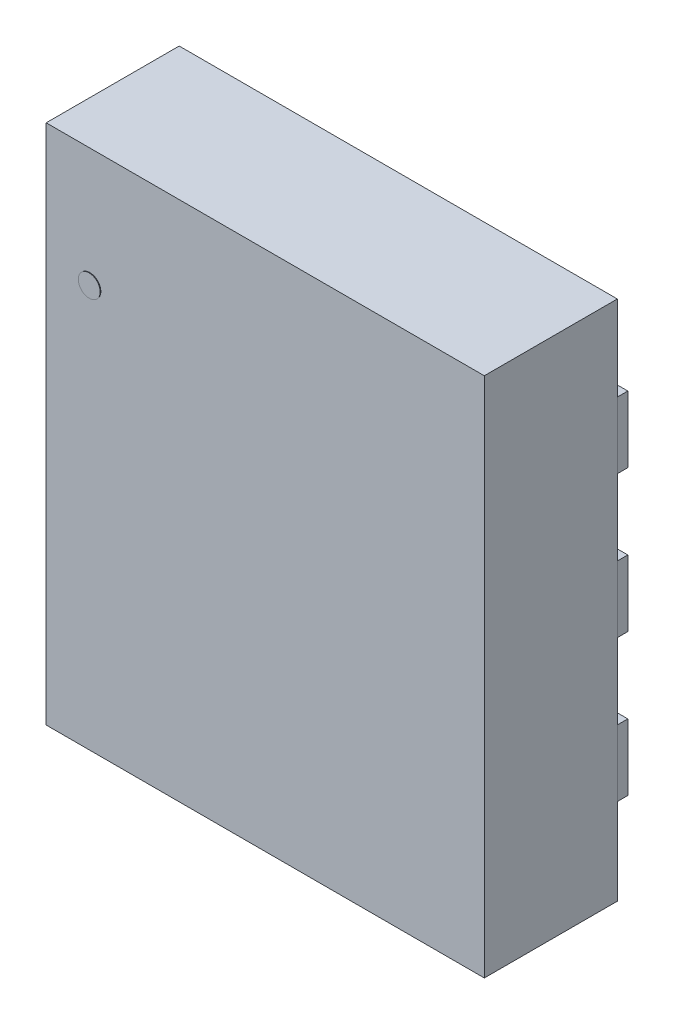
ISO-10303-21;
HEADER;
FILE_DESCRIPTION(('STEP AP214'),'2;1');
FILE_NAME('part.step','',(''),(''),'','','');
FILE_SCHEMA(('AUTOMOTIVE_DESIGN { 1 0 10303 214 1 1 1 1 }'));
ENDSEC;
DATA;
#1=APPLICATION_CONTEXT('core data for automotive mechanical design processes');
#2=APPLICATION_PROTOCOL_DEFINITION('international standard','automotive_design',2000,#1);
#3=PRODUCT_CONTEXT('',#1,'mechanical');
#4=PRODUCT('Part','Part','',(#3));
#5=PRODUCT_RELATED_PRODUCT_CATEGORY('part','',(#4));
#6=PRODUCT_DEFINITION_FORMATION('','',#4);
#7=PRODUCT_DEFINITION_CONTEXT('part definition',#1,'design');
#8=PRODUCT_DEFINITION('design','',#6,#7);
#9=PRODUCT_DEFINITION_SHAPE('','',#8);
#10=(LENGTH_UNIT() NAMED_UNIT(*) SI_UNIT(.MILLI.,.METRE.));
#11=(NAMED_UNIT(*) PLANE_ANGLE_UNIT() SI_UNIT($,.RADIAN.));
#12=(NAMED_UNIT(*) SI_UNIT($,.STERADIAN.) SOLID_ANGLE_UNIT());
#13=UNCERTAINTY_MEASURE_WITH_UNIT(LENGTH_MEASURE(1.E-05),#10,'distance_accuracy_value','');
#14=(GEOMETRIC_REPRESENTATION_CONTEXT(3) GLOBAL_UNCERTAINTY_ASSIGNED_CONTEXT((#13)) GLOBAL_UNIT_ASSIGNED_CONTEXT((#10,
#11,#12)) REPRESENTATION_CONTEXT('',''));
#15=CARTESIAN_POINT('',(0.,0.,0.));
#16=DIRECTION('',(0.,0.,1.));
#17=DIRECTION('',(1.,0.,0.));
#18=AXIS2_PLACEMENT_3D('',#15,#16,#17);
#19=CARTESIAN_POINT('',(-0.803,0.65,0.663));
#20=DIRECTION('',(0.,0.,1.));
#21=DIRECTION('',(1.,0.,0.));
#22=AXIS2_PLACEMENT_3D('',#19,#20,#21);
#23=PLANE('',#22);
#24=CARTESIAN_POINT('',(-0.803,0.65,0.663));
#25=DIRECTION('',(0.,0.,1.));
#26=DIRECTION('',(1.,0.,0.));
#27=AXIS2_PLACEMENT_3D('',#24,#25,#26);
#28=CIRCLE('',#27,0.050165);
#29=CARTESIAN_POINT('',(-0.853,0.65,0.663));
#30=VERTEX_POINT('',#29);
#31=EDGE_CURVE('P0_E44',#30,#30,#28,.T.);
#32=ORIENTED_EDGE('',*,*,#31,.T.);
#33=EDGE_LOOP('',(#32));
#34=FACE_BOUND('',#33,.T.);
#35=ADVANCED_FACE('P0_F16',(#34),#23,.T.);
#36=CARTESIAN_POINT('',(-0.803,0.65,0.66));
#37=DIRECTION('',(0.,0.,1.));
#38=DIRECTION('',(1.,0.,0.));
#39=AXIS2_PLACEMENT_3D('',#36,#37,#38);
#40=PLANE('',#39);
#41=CARTESIAN_POINT('',(-0.803,0.65,0.66));
#42=DIRECTION('',(0.,0.,-1.));
#43=DIRECTION('',(1.,0.,0.));
#44=AXIS2_PLACEMENT_3D('',#41,#42,#43);
#45=CIRCLE('',#44,0.050165);
#46=CARTESIAN_POINT('',(-0.853,0.65,0.66));
#47=VERTEX_POINT('',#46);
#48=EDGE_CURVE('P0_E11',#47,#47,#45,.T.);
#49=ORIENTED_EDGE('',*,*,#48,.T.);
#50=EDGE_LOOP('',(#49));
#51=FACE_BOUND('',#50,.T.);
#52=ADVANCED_FACE('P0_F18',(#51),#40,.F.);
#53=CARTESIAN_POINT('',(-0.803,0.65,0.66));
#54=DIRECTION('',(0.,0.,1.));
#55=DIRECTION('',(1.,0.,0.));
#56=AXIS2_PLACEMENT_3D('',#53,#54,#55);
#57=CYLINDRICAL_SURFACE('',#56,0.050165);
#58=ORIENTED_EDGE('',*,*,#31,.F.);
#59=CARTESIAN_POINT('',(-0.853165,0.65,0.66));
#60=CARTESIAN_POINT('',(-0.853165,0.65,0.663));
#61=(BOUNDED_CURVE() B_SPLINE_CURVE(1,(#59,#60),.UNSPECIFIED.,.F.,
.F.) B_SPLINE_CURVE_WITH_KNOTS((2,2),(0.,0.003),
.UNSPECIFIED.) CURVE() GEOMETRIC_REPRESENTATION_ITEM() RATIONAL_B_SPLINE_CURVE((1.,1.)) REPRESENTATION_ITEM(''));
#62=EDGE_CURVE('P0_E27',#47,#30,#61,.T.);
#63=ORIENTED_EDGE('',*,*,#62,.F.);
#64=ORIENTED_EDGE('',*,*,#48,.F.);
#65=ORIENTED_EDGE('',*,*,#62,.T.);
#66=EDGE_LOOP('',(#58,#63,#64,#65));
#67=FACE_BOUND('',#66,.T.);
#68=ADVANCED_FACE('P0_F43',(#67),#57,.T.);
#69=CLOSED_SHELL('',(#35,#52,#68));
#70=MANIFOLD_SOLID_BREP('P0_B1',#69);
#71=CARTESIAN_POINT('',(-1.003,-1.194,0.66));
#72=DIRECTION('',(0.,0.,1.));
#73=DIRECTION('',(1.,0.,0.));
#74=AXIS2_PLACEMENT_3D('',#71,#72,#73);
#75=PLANE('',#74);
#76=DIRECTION('',(1.,0.,0.));
#77=VECTOR('',#76,1.);
#78=CARTESIAN_POINT('',(-1.003,-1.194,0.66));
#79=LINE('',#78,#77);
#80=CARTESIAN_POINT('',(-1.003,-1.194,0.66));
#81=VERTEX_POINT('',#80);
#82=CARTESIAN_POINT('',(1.003,-1.194,0.66));
#83=VERTEX_POINT('',#82);
#84=EDGE_CURVE('P1_E89',#81,#83,#79,.T.);
#85=ORIENTED_EDGE('',*,*,#84,.T.);
#86=DIRECTION('',(0.,1.,0.));
#87=VECTOR('',#86,1.);
#88=CARTESIAN_POINT('',(1.003,-1.194,0.66));
#89=LINE('',#88,#87);
#90=CARTESIAN_POINT('',(1.003,1.194,0.66));
#91=VERTEX_POINT('',#90);
#92=EDGE_CURVE('P1_E57',#83,#91,#89,.T.);
#93=ORIENTED_EDGE('',*,*,#92,.T.);
#94=DIRECTION('',(-1.,0.,0.));
#95=VECTOR('',#94,1.);
#96=CARTESIAN_POINT('',(1.003,1.194,0.66));
#97=LINE('',#96,#95);
#98=CARTESIAN_POINT('',(-1.003,1.194,0.66));
#99=VERTEX_POINT('',#98);
#100=EDGE_CURVE('P1_E103',#91,#99,#97,.T.);
#101=ORIENTED_EDGE('',*,*,#100,.T.);
#102=DIRECTION('',(0.,-1.,0.));
#103=VECTOR('',#102,1.);
#104=CARTESIAN_POINT('',(-1.003,1.194,0.66));
#105=LINE('',#104,#103);
#106=EDGE_CURVE('P1_E11',#99,#81,#105,.T.);
#107=ORIENTED_EDGE('',*,*,#106,.T.);
#108=EDGE_LOOP('',(#85,#93,#101,#107));
#109=FACE_BOUND('',#108,.T.);
#110=ADVANCED_FACE('P1_F16',(#109),#75,.T.);
#111=CARTESIAN_POINT('',(-1.003,1.194,0.051));
#112=DIRECTION('',(0.,0.,-1.));
#113=DIRECTION('',(0.,-1.,0.));
#114=AXIS2_PLACEMENT_3D('',#111,#112,#113);
#115=PLANE('',#114);
#116=DIRECTION('',(1.,0.,0.));
#117=VECTOR('',#116,1.);
#118=CARTESIAN_POINT('',(-1.003,1.194,0.051));
#119=LINE('',#118,#117);
#120=CARTESIAN_POINT('',(-1.003,1.194,0.051));
#121=VERTEX_POINT('',#120);
#122=CARTESIAN_POINT('',(1.003,1.194,0.051));
#123=VERTEX_POINT('',#122);
#124=EDGE_CURVE('P1_E79',#121,#123,#119,.T.);
#125=ORIENTED_EDGE('',*,*,#124,.T.);
#126=DIRECTION('',(0.,-1.,0.));
#127=VECTOR('',#126,1.);
#128=CARTESIAN_POINT('',(1.003,1.194,0.051));
#129=LINE('',#128,#127);
#130=CARTESIAN_POINT('',(1.003,-1.194,0.051));
#131=VERTEX_POINT('',#130);
#132=EDGE_CURVE('P1_E74',#123,#131,#129,.T.);
#133=ORIENTED_EDGE('',*,*,#132,.T.);
#134=DIRECTION('',(-1.,0.,0.));
#135=VECTOR('',#134,1.);
#136=CARTESIAN_POINT('',(1.003,-1.194,0.051));
#137=LINE('',#136,#135);
#138=CARTESIAN_POINT('',(-1.003,-1.194,0.051));
#139=VERTEX_POINT('',#138);
#140=EDGE_CURVE('P1_E77',#131,#139,#137,.T.);
#141=ORIENTED_EDGE('',*,*,#140,.T.);
#142=DIRECTION('',(0.,1.,0.));
#143=VECTOR('',#142,1.);
#144=CARTESIAN_POINT('',(-1.003,-1.194,0.051));
#145=LINE('',#144,#143);
#146=EDGE_CURVE('P1_E27',#139,#121,#145,.T.);
#147=ORIENTED_EDGE('',*,*,#146,.T.);
#148=EDGE_LOOP('',(#125,#133,#141,#147));
#149=FACE_BOUND('',#148,.T.);
#150=ADVANCED_FACE('P1_F75',(#149),#115,.T.);
#151=CARTESIAN_POINT('',(-1.003,1.194,0.051));
#152=DIRECTION('',(-1.,0.,0.));
#153=DIRECTION('',(0.,0.,1.));
#154=AXIS2_PLACEMENT_3D('',#151,#152,#153);
#155=PLANE('',#154);
#156=ORIENTED_EDGE('',*,*,#146,.F.);
#157=DIRECTION('',(0.,0.,1.));
#158=VECTOR('',#157,1.);
#159=CARTESIAN_POINT('',(-1.003,-1.194,0.051));
#160=LINE('',#159,#158);
#161=EDGE_CURVE('P1_E82',#139,#81,#160,.T.);
#162=ORIENTED_EDGE('',*,*,#161,.T.);
#163=ORIENTED_EDGE('',*,*,#106,.F.);
#164=DIRECTION('',(0.,0.,-1.));
#165=VECTOR('',#164,1.);
#166=CARTESIAN_POINT('',(-1.003,1.194,0.66));
#167=LINE('',#166,#165);
#168=EDGE_CURVE('P1_E99',#99,#121,#167,.T.);
#169=ORIENTED_EDGE('',*,*,#168,.T.);
#170=EDGE_LOOP('',(#156,#162,#163,#169));
#171=FACE_BOUND('',#170,.T.);
#172=ADVANCED_FACE('P1_F112',(#171),#155,.T.);
#173=CARTESIAN_POINT('',(1.003,1.194,0.051));
#174=DIRECTION('',(0.,1.,0.));
#175=DIRECTION('',(1.,0.,0.));
#176=AXIS2_PLACEMENT_3D('',#173,#174,#175);
#177=PLANE('',#176);
#178=ORIENTED_EDGE('',*,*,#124,.F.);
#179=ORIENTED_EDGE('',*,*,#168,.F.);
#180=ORIENTED_EDGE('',*,*,#100,.F.);
#181=DIRECTION('',(0.,0.,-1.));
#182=VECTOR('',#181,1.);
#183=CARTESIAN_POINT('',(1.003,1.194,0.66));
#184=LINE('',#183,#182);
#185=EDGE_CURVE('P1_E20',#91,#123,#184,.T.);
#186=ORIENTED_EDGE('',*,*,#185,.T.);
#187=EDGE_LOOP('',(#178,#179,#180,#186));
#188=FACE_BOUND('',#187,.T.);
#189=ADVANCED_FACE('P1_F114',(#188),#177,.T.);
#190=CARTESIAN_POINT('',(1.003,-1.194,0.051));
#191=DIRECTION('',(1.,0.,0.));
#192=DIRECTION('',(0.,1.,0.));
#193=AXIS2_PLACEMENT_3D('',#190,#191,#192);
#194=PLANE('',#193);
#195=ORIENTED_EDGE('',*,*,#132,.F.);
#196=ORIENTED_EDGE('',*,*,#185,.F.);
#197=ORIENTED_EDGE('',*,*,#92,.F.);
#198=DIRECTION('',(0.,0.,-1.));
#199=VECTOR('',#198,1.);
#200=CARTESIAN_POINT('',(1.003,-1.194,0.66));
#201=LINE('',#200,#199);
#202=EDGE_CURVE('P1_E85',#83,#131,#201,.T.);
#203=ORIENTED_EDGE('',*,*,#202,.T.);
#204=EDGE_LOOP('',(#195,#196,#197,#203));
#205=FACE_BOUND('',#204,.T.);
#206=ADVANCED_FACE('P1_F18',(#205),#194,.T.);
#207=CARTESIAN_POINT('',(-1.003,-1.194,0.051));
#208=DIRECTION('',(0.,-1.,0.));
#209=DIRECTION('',(0.,0.,-1.));
#210=AXIS2_PLACEMENT_3D('',#207,#208,#209);
#211=PLANE('',#210);
#212=ORIENTED_EDGE('',*,*,#140,.F.);
#213=ORIENTED_EDGE('',*,*,#202,.F.);
#214=ORIENTED_EDGE('',*,*,#84,.F.);
#215=ORIENTED_EDGE('',*,*,#161,.F.);
#216=EDGE_LOOP('',(#212,#213,#214,#215));
#217=FACE_BOUND('',#216,.T.);
#218=ADVANCED_FACE('P1_F91',(#217),#211,.T.);
#219=CLOSED_SHELL('',(#110,#150,#172,#189,#206,#218));
#220=MANIFOLD_SOLID_BREP('P1_B1',#219);
#221=CARTESIAN_POINT('',(0.238,0.498,0.051));
#222=DIRECTION('',(0.,0.,1.));
#223=DIRECTION('',(1.,0.,0.));
#224=AXIS2_PLACEMENT_3D('',#221,#222,#223);
#225=PLANE('',#224);
#226=DIRECTION('',(1.,0.,0.));
#227=VECTOR('',#226,1.);
#228=CARTESIAN_POINT('',(0.238,0.498,0.051));
#229=LINE('',#228,#227);
#230=CARTESIAN_POINT('',(0.238,0.498,0.051));
#231=VERTEX_POINT('',#230);
#232=CARTESIAN_POINT('',(1.,0.498,0.051));
#233=VERTEX_POINT('',#232);
#234=EDGE_CURVE('P2_E89',#231,#233,#229,.T.);
#235=ORIENTED_EDGE('',*,*,#234,.T.);
#236=DIRECTION('',(0.,1.,0.));
#237=VECTOR('',#236,1.);
#238=CARTESIAN_POINT('',(1.,0.498,0.051));
#239=LINE('',#238,#237);
#240=CARTESIAN_POINT('',(1.,0.802,0.051));
#241=VERTEX_POINT('',#240);
#242=EDGE_CURVE('P2_E87',#233,#241,#239,.T.);
#243=ORIENTED_EDGE('',*,*,#242,.T.);
#244=DIRECTION('',(-1.,0.,0.));
#245=VECTOR('',#244,1.);
#246=CARTESIAN_POINT('',(1.,0.802,0.051));
#247=LINE('',#246,#245);
#248=CARTESIAN_POINT('',(0.238,0.802,0.051));
#249=VERTEX_POINT('',#248);
#250=EDGE_CURVE('P2_E78',#241,#249,#247,.T.);
#251=ORIENTED_EDGE('',*,*,#250,.T.);
#252=DIRECTION('',(0.,-1.,0.));
#253=VECTOR('',#252,1.);
#254=CARTESIAN_POINT('',(0.238,0.802,0.051));
#255=LINE('',#254,#253);
#256=EDGE_CURVE('P2_E11',#249,#231,#255,.T.);
#257=ORIENTED_EDGE('',*,*,#256,.T.);
#258=EDGE_LOOP('',(#235,#243,#251,#257));
#259=FACE_BOUND('',#258,.T.);
#260=ADVANCED_FACE('P2_F16',(#259),#225,.T.);
#261=CARTESIAN_POINT('',(0.238,0.802,0.));
#262=DIRECTION('',(0.,0.,-1.));
#263=DIRECTION('',(0.,-1.,0.));
#264=AXIS2_PLACEMENT_3D('',#261,#262,#263);
#265=PLANE('',#264);
#266=DIRECTION('',(1.,0.,0.));
#267=VECTOR('',#266,1.);
#268=CARTESIAN_POINT('',(0.238,0.802,0.));
#269=LINE('',#268,#267);
#270=CARTESIAN_POINT('',(0.238,0.802,0.));
#271=VERTEX_POINT('',#270);
#272=CARTESIAN_POINT('',(1.,0.802,0.));
#273=VERTEX_POINT('',#272);
#274=EDGE_CURVE('P2_E72',#271,#273,#269,.T.);
#275=ORIENTED_EDGE('',*,*,#274,.T.);
#276=DIRECTION('',(0.,-1.,0.));
#277=VECTOR('',#276,1.);
#278=CARTESIAN_POINT('',(1.,0.802,0.));
#279=LINE('',#278,#277);
#280=CARTESIAN_POINT('',(1.,0.498,0.));
#281=VERTEX_POINT('',#280);
#282=EDGE_CURVE('P2_E60',#273,#281,#279,.T.);
#283=ORIENTED_EDGE('',*,*,#282,.T.);
#284=DIRECTION('',(-1.,0.,0.));
#285=VECTOR('',#284,1.);
#286=CARTESIAN_POINT('',(1.,0.498,0.));
#287=LINE('',#286,#285);
#288=CARTESIAN_POINT('',(0.238,0.498,0.));
#289=VERTEX_POINT('',#288);
#290=EDGE_CURVE('P2_E105',#281,#289,#287,.T.);
#291=ORIENTED_EDGE('',*,*,#290,.T.);
#292=DIRECTION('',(0.,1.,0.));
#293=VECTOR('',#292,1.);
#294=CARTESIAN_POINT('',(0.238,0.498,0.));
#295=LINE('',#294,#293);
#296=EDGE_CURVE('P2_E27',#289,#271,#295,.T.);
#297=ORIENTED_EDGE('',*,*,#296,.T.);
#298=EDGE_LOOP('',(#275,#283,#291,#297));
#299=FACE_BOUND('',#298,.T.);
#300=ADVANCED_FACE('P2_F18',(#299),#265,.T.);
#301=CARTESIAN_POINT('',(0.238,0.802,0.));
#302=DIRECTION('',(-1.,0.,0.));
#303=DIRECTION('',(0.,0.,1.));
#304=AXIS2_PLACEMENT_3D('',#301,#302,#303);
#305=PLANE('',#304);
#306=ORIENTED_EDGE('',*,*,#296,.F.);
#307=DIRECTION('',(0.,0.,1.));
#308=VECTOR('',#307,1.);
#309=CARTESIAN_POINT('',(0.238,0.498,0.));
#310=LINE('',#309,#308);
#311=EDGE_CURVE('P2_E100',#289,#231,#310,.T.);
#312=ORIENTED_EDGE('',*,*,#311,.T.);
#313=ORIENTED_EDGE('',*,*,#256,.F.);
#314=DIRECTION('',(0.,0.,-1.));
#315=VECTOR('',#314,1.);
#316=CARTESIAN_POINT('',(0.238,0.802,0.051));
#317=LINE('',#316,#315);
#318=EDGE_CURVE('P2_E20',#249,#271,#317,.T.);
#319=ORIENTED_EDGE('',*,*,#318,.T.);
#320=EDGE_LOOP('',(#306,#312,#313,#319));
#321=FACE_BOUND('',#320,.T.);
#322=ADVANCED_FACE('P2_F117',(#321),#305,.T.);
#323=CARTESIAN_POINT('',(1.,0.802,0.));
#324=DIRECTION('',(0.,1.,0.));
#325=DIRECTION('',(1.,0.,0.));
#326=AXIS2_PLACEMENT_3D('',#323,#324,#325);
#327=PLANE('',#326);
#328=ORIENTED_EDGE('',*,*,#274,.F.);
#329=ORIENTED_EDGE('',*,*,#318,.F.);
#330=ORIENTED_EDGE('',*,*,#250,.F.);
#331=DIRECTION('',(0.,0.,-1.));
#332=VECTOR('',#331,1.);
#333=CARTESIAN_POINT('',(1.,0.802,0.051));
#334=LINE('',#333,#332);
#335=EDGE_CURVE('P2_E82',#241,#273,#334,.T.);
#336=ORIENTED_EDGE('',*,*,#335,.T.);
#337=EDGE_LOOP('',(#328,#329,#330,#336));
#338=FACE_BOUND('',#337,.T.);
#339=ADVANCED_FACE('P2_F80',(#338),#327,.T.);
#340=CARTESIAN_POINT('',(1.,0.498,0.));
#341=DIRECTION('',(1.,0.,0.));
#342=DIRECTION('',(0.,1.,0.));
#343=AXIS2_PLACEMENT_3D('',#340,#341,#342);
#344=PLANE('',#343);
#345=ORIENTED_EDGE('',*,*,#282,.F.);
#346=ORIENTED_EDGE('',*,*,#335,.F.);
#347=ORIENTED_EDGE('',*,*,#242,.F.);
#348=DIRECTION('',(0.,0.,-1.));
#349=VECTOR('',#348,1.);
#350=CARTESIAN_POINT('',(1.,0.498,0.051));
#351=LINE('',#350,#349);
#352=EDGE_CURVE('P2_E103',#233,#281,#351,.T.);
#353=ORIENTED_EDGE('',*,*,#352,.T.);
#354=EDGE_LOOP('',(#345,#346,#347,#353));
#355=FACE_BOUND('',#354,.T.);
#356=ADVANCED_FACE('P2_F94',(#355),#344,.T.);
#357=CARTESIAN_POINT('',(0.238,0.498,0.));
#358=DIRECTION('',(0.,-1.,0.));
#359=DIRECTION('',(0.,0.,-1.));
#360=AXIS2_PLACEMENT_3D('',#357,#358,#359);
#361=PLANE('',#360);
#362=ORIENTED_EDGE('',*,*,#290,.F.);
#363=ORIENTED_EDGE('',*,*,#352,.F.);
#364=ORIENTED_EDGE('',*,*,#234,.F.);
#365=ORIENTED_EDGE('',*,*,#311,.F.);
#366=EDGE_LOOP('',(#362,#363,#364,#365));
#367=FACE_BOUND('',#366,.T.);
#368=ADVANCED_FACE('P2_F130',(#367),#361,.T.);
#369=CLOSED_SHELL('',(#260,#300,#322,#339,#356,#368));
#370=MANIFOLD_SOLID_BREP('P2_B1',#369);
#371=CARTESIAN_POINT('',(0.238,-0.152,0.051));
#372=DIRECTION('',(0.,0.,1.));
#373=DIRECTION('',(1.,0.,0.));
#374=AXIS2_PLACEMENT_3D('',#371,#372,#373);
#375=PLANE('',#374);
#376=DIRECTION('',(1.,0.,0.));
#377=VECTOR('',#376,1.);
#378=CARTESIAN_POINT('',(0.238,-0.152,0.051));
#379=LINE('',#378,#377);
#380=CARTESIAN_POINT('',(0.238,-0.152,0.051));
#381=VERTEX_POINT('',#380);
#382=CARTESIAN_POINT('',(1.,-0.152,0.051));
#383=VERTEX_POINT('',#382);
#384=EDGE_CURVE('P3_E83',#381,#383,#379,.T.);
#385=ORIENTED_EDGE('',*,*,#384,.T.);
#386=DIRECTION('',(0.,1.,0.));
#387=VECTOR('',#386,1.);
#388=CARTESIAN_POINT('',(1.,-0.152,0.051));
#389=LINE('',#388,#387);
#390=CARTESIAN_POINT('',(1.,0.152,0.051));
#391=VERTEX_POINT('',#390);
#392=EDGE_CURVE('P3_E67',#383,#391,#389,.T.);
#393=ORIENTED_EDGE('',*,*,#392,.T.);
#394=DIRECTION('',(-1.,0.,0.));
#395=VECTOR('',#394,1.);
#396=CARTESIAN_POINT('',(1.,0.152,0.051));
#397=LINE('',#396,#395);
#398=CARTESIAN_POINT('',(0.238,0.152,0.051));
#399=VERTEX_POINT('',#398);
#400=EDGE_CURVE('P3_E74',#391,#399,#397,.T.);
#401=ORIENTED_EDGE('',*,*,#400,.T.);
#402=DIRECTION('',(0.,-1.,0.));
#403=VECTOR('',#402,1.);
#404=CARTESIAN_POINT('',(0.238,0.152,0.051));
#405=LINE('',#404,#403);
#406=EDGE_CURVE('P3_E11',#399,#381,#405,.T.);
#407=ORIENTED_EDGE('',*,*,#406,.T.);
#408=EDGE_LOOP('',(#385,#393,#401,#407));
#409=FACE_BOUND('',#408,.T.);
#410=ADVANCED_FACE('P3_F16',(#409),#375,.T.);
#411=CARTESIAN_POINT('',(0.238,0.152,0.));
#412=DIRECTION('',(0.,0.,-1.));
#413=DIRECTION('',(0.,-1.,0.));
#414=AXIS2_PLACEMENT_3D('',#411,#412,#413);
#415=PLANE('',#414);
#416=DIRECTION('',(1.,0.,0.));
#417=VECTOR('',#416,1.);
#418=CARTESIAN_POINT('',(0.238,0.152,0.));
#419=LINE('',#418,#417);
#420=CARTESIAN_POINT('',(0.238,0.152,0.));
#421=VERTEX_POINT('',#420);
#422=CARTESIAN_POINT('',(1.,0.152,0.));
#423=VERTEX_POINT('',#422);
#424=EDGE_CURVE('P3_E20',#421,#423,#419,.T.);
#425=ORIENTED_EDGE('',*,*,#424,.T.);
#426=DIRECTION('',(0.,-1.,0.));
#427=VECTOR('',#426,1.);
#428=CARTESIAN_POINT('',(1.,0.152,0.));
#429=LINE('',#428,#427);
#430=CARTESIAN_POINT('',(1.,-0.152,0.));
#431=VERTEX_POINT('',#430);
#432=EDGE_CURVE('P3_E88',#423,#431,#429,.T.);
#433=ORIENTED_EDGE('',*,*,#432,.T.);
#434=DIRECTION('',(-1.,0.,0.));
#435=VECTOR('',#434,1.);
#436=CARTESIAN_POINT('',(1.,-0.152,0.));
#437=LINE('',#436,#435);
#438=CARTESIAN_POINT('',(0.238,-0.152,0.));
#439=VERTEX_POINT('',#438);
#440=EDGE_CURVE('P3_E106',#431,#439,#437,.T.);
#441=ORIENTED_EDGE('',*,*,#440,.T.);
#442=DIRECTION('',(0.,1.,0.));
#443=VECTOR('',#442,1.);
#444=CARTESIAN_POINT('',(0.238,-0.152,0.));
#445=LINE('',#444,#443);
#446=EDGE_CURVE('P3_E27',#439,#421,#445,.T.);
#447=ORIENTED_EDGE('',*,*,#446,.T.);
#448=EDGE_LOOP('',(#425,#433,#441,#447));
#449=FACE_BOUND('',#448,.T.);
#450=ADVANCED_FACE('P3_F115',(#449),#415,.T.);
#451=CARTESIAN_POINT('',(0.238,0.152,0.));
#452=DIRECTION('',(-1.,0.,0.));
#453=DIRECTION('',(0.,0.,1.));
#454=AXIS2_PLACEMENT_3D('',#451,#452,#453);
#455=PLANE('',#454);
#456=ORIENTED_EDGE('',*,*,#446,.F.);
#457=DIRECTION('',(0.,0.,1.));
#458=VECTOR('',#457,1.);
#459=CARTESIAN_POINT('',(0.238,-0.152,0.));
#460=LINE('',#459,#458);
#461=EDGE_CURVE('P3_E94',#439,#381,#460,.T.);
#462=ORIENTED_EDGE('',*,*,#461,.T.);
#463=ORIENTED_EDGE('',*,*,#406,.F.);
#464=DIRECTION('',(0.,0.,-1.));
#465=VECTOR('',#464,1.);
#466=CARTESIAN_POINT('',(0.238,0.152,0.051));
#467=LINE('',#466,#465);
#468=EDGE_CURVE('P3_E79',#399,#421,#467,.T.);
#469=ORIENTED_EDGE('',*,*,#468,.T.);
#470=EDGE_LOOP('',(#456,#462,#463,#469));
#471=FACE_BOUND('',#470,.T.);
#472=ADVANCED_FACE('P3_F117',(#471),#455,.T.);
#473=CARTESIAN_POINT('',(1.,0.152,0.));
#474=DIRECTION('',(0.,1.,0.));
#475=DIRECTION('',(1.,0.,0.));
#476=AXIS2_PLACEMENT_3D('',#473,#474,#475);
#477=PLANE('',#476);
#478=ORIENTED_EDGE('',*,*,#424,.F.);
#479=ORIENTED_EDGE('',*,*,#468,.F.);
#480=ORIENTED_EDGE('',*,*,#400,.F.);
#481=DIRECTION('',(0.,0.,-1.));
#482=VECTOR('',#481,1.);
#483=CARTESIAN_POINT('',(1.,0.152,0.051));
#484=LINE('',#483,#482);
#485=EDGE_CURVE('P3_E77',#391,#423,#484,.T.);
#486=ORIENTED_EDGE('',*,*,#485,.T.);
#487=EDGE_LOOP('',(#478,#479,#480,#486));
#488=FACE_BOUND('',#487,.T.);
#489=ADVANCED_FACE('P3_F76',(#488),#477,.T.);
#490=CARTESIAN_POINT('',(1.,-0.152,0.));
#491=DIRECTION('',(1.,0.,0.));
#492=DIRECTION('',(0.,1.,0.));
#493=AXIS2_PLACEMENT_3D('',#490,#491,#492);
#494=PLANE('',#493);
#495=ORIENTED_EDGE('',*,*,#432,.F.);
#496=ORIENTED_EDGE('',*,*,#485,.F.);
#497=ORIENTED_EDGE('',*,*,#392,.F.);
#498=DIRECTION('',(0.,0.,-1.));
#499=VECTOR('',#498,1.);
#500=CARTESIAN_POINT('',(1.,-0.152,0.051));
#501=LINE('',#500,#499);
#502=EDGE_CURVE('P3_E97',#383,#431,#501,.T.);
#503=ORIENTED_EDGE('',*,*,#502,.T.);
#504=EDGE_LOOP('',(#495,#496,#497,#503));
#505=FACE_BOUND('',#504,.T.);
#506=ADVANCED_FACE('P3_F18',(#505),#494,.T.);
#507=CARTESIAN_POINT('',(0.238,-0.152,0.));
#508=DIRECTION('',(0.,-1.,0.));
#509=DIRECTION('',(0.,0.,-1.));
#510=AXIS2_PLACEMENT_3D('',#507,#508,#509);
#511=PLANE('',#510);
#512=ORIENTED_EDGE('',*,*,#440,.F.);
#513=ORIENTED_EDGE('',*,*,#502,.F.);
#514=ORIENTED_EDGE('',*,*,#384,.F.);
#515=ORIENTED_EDGE('',*,*,#461,.F.);
#516=EDGE_LOOP('',(#512,#513,#514,#515));
#517=FACE_BOUND('',#516,.T.);
#518=ADVANCED_FACE('P3_F122',(#517),#511,.T.);
#519=CLOSED_SHELL('',(#410,#450,#472,#489,#506,#518));
#520=MANIFOLD_SOLID_BREP('P3_B1',#519);
#521=CARTESIAN_POINT('',(0.238,-0.802,0.051));
#522=DIRECTION('',(0.,0.,1.));
#523=DIRECTION('',(1.,0.,0.));
#524=AXIS2_PLACEMENT_3D('',#521,#522,#523);
#525=PLANE('',#524);
#526=DIRECTION('',(1.,0.,0.));
#527=VECTOR('',#526,1.);
#528=CARTESIAN_POINT('',(0.238,-0.802,0.051));
#529=LINE('',#528,#527);
#530=CARTESIAN_POINT('',(0.238,-0.802,0.051));
#531=VERTEX_POINT('',#530);
#532=CARTESIAN_POINT('',(1.,-0.802,0.051));
#533=VERTEX_POINT('',#532);
#534=EDGE_CURVE('P4_E85',#531,#533,#529,.T.);
#535=ORIENTED_EDGE('',*,*,#534,.T.);
#536=DIRECTION('',(0.,1.,0.));
#537=VECTOR('',#536,1.);
#538=CARTESIAN_POINT('',(1.,-0.802,0.051));
#539=LINE('',#538,#537);
#540=CARTESIAN_POINT('',(1.,-0.498,0.051));
#541=VERTEX_POINT('',#540);
#542=EDGE_CURVE('P4_E72',#533,#541,#539,.T.);
#543=ORIENTED_EDGE('',*,*,#542,.T.);
#544=DIRECTION('',(-1.,0.,0.));
#545=VECTOR('',#544,1.);
#546=CARTESIAN_POINT('',(1.,-0.498,0.051));
#547=LINE('',#546,#545);
#548=CARTESIAN_POINT('',(0.238,-0.498,0.051));
#549=VERTEX_POINT('',#548);
#550=EDGE_CURVE('P4_E102',#541,#549,#547,.T.);
#551=ORIENTED_EDGE('',*,*,#550,.T.);
#552=DIRECTION('',(0.,-1.,0.));
#553=VECTOR('',#552,1.);
#554=CARTESIAN_POINT('',(0.238,-0.498,0.051));
#555=LINE('',#554,#553);
#556=EDGE_CURVE('P4_E11',#549,#531,#555,.T.);
#557=ORIENTED_EDGE('',*,*,#556,.T.);
#558=EDGE_LOOP('',(#535,#543,#551,#557));
#559=FACE_BOUND('',#558,.T.);
#560=ADVANCED_FACE('P4_F16',(#559),#525,.T.);
#561=CARTESIAN_POINT('',(0.238,-0.498,0.));
#562=DIRECTION('',(0.,0.,-1.));
#563=DIRECTION('',(0.,-1.,0.));
#564=AXIS2_PLACEMENT_3D('',#561,#562,#563);
#565=PLANE('',#564);
#566=DIRECTION('',(1.,0.,0.));
#567=VECTOR('',#566,1.);
#568=CARTESIAN_POINT('',(0.238,-0.498,0.));
#569=LINE('',#568,#567);
#570=CARTESIAN_POINT('',(0.238,-0.498,0.));
#571=VERTEX_POINT('',#570);
#572=CARTESIAN_POINT('',(1.,-0.498,0.));
#573=VERTEX_POINT('',#572);
#574=EDGE_CURVE('P4_E82',#571,#573,#569,.T.);
#575=ORIENTED_EDGE('',*,*,#574,.T.);
#576=DIRECTION('',(0.,-1.,0.));
#577=VECTOR('',#576,1.);
#578=CARTESIAN_POINT('',(1.,-0.498,0.));
#579=LINE('',#578,#577);
#580=CARTESIAN_POINT('',(1.,-0.802,0.));
#581=VERTEX_POINT('',#580);
#582=EDGE_CURVE('P4_E104',#573,#581,#579,.T.);
#583=ORIENTED_EDGE('',*,*,#582,.T.);
#584=DIRECTION('',(-1.,0.,0.));
#585=VECTOR('',#584,1.);
#586=CARTESIAN_POINT('',(1.,-0.802,0.));
#587=LINE('',#586,#585);
#588=CARTESIAN_POINT('',(0.238,-0.802,0.));
#589=VERTEX_POINT('',#588);
#590=EDGE_CURVE('P4_E92',#581,#589,#587,.T.);
#591=ORIENTED_EDGE('',*,*,#590,.T.);
#592=DIRECTION('',(0.,1.,0.));
#593=VECTOR('',#592,1.);
#594=CARTESIAN_POINT('',(0.238,-0.802,0.));
#595=LINE('',#594,#593);
#596=EDGE_CURVE('P4_E26',#589,#571,#595,.T.);
#597=ORIENTED_EDGE('',*,*,#596,.T.);
#598=EDGE_LOOP('',(#575,#583,#591,#597));
#599=FACE_BOUND('',#598,.T.);
#600=ADVANCED_FACE('P4_F120',(#599),#565,.T.);
#601=CARTESIAN_POINT('',(0.238,-0.498,0.));
#602=DIRECTION('',(-1.,0.,0.));
#603=DIRECTION('',(0.,0.,1.));
#604=AXIS2_PLACEMENT_3D('',#601,#602,#603);
#605=PLANE('',#604);
#606=ORIENTED_EDGE('',*,*,#596,.F.);
#607=DIRECTION('',(0.,0.,1.));
#608=VECTOR('',#607,1.);
#609=CARTESIAN_POINT('',(0.238,-0.802,0.));
#610=LINE('',#609,#608);
#611=EDGE_CURVE('P4_E89',#589,#531,#610,.T.);
#612=ORIENTED_EDGE('',*,*,#611,.T.);
#613=ORIENTED_EDGE('',*,*,#556,.F.);
#614=DIRECTION('',(0.,0.,-1.));
#615=VECTOR('',#614,1.);
#616=CARTESIAN_POINT('',(0.238,-0.498,0.051));
#617=LINE('',#616,#615);
#618=EDGE_CURVE('P4_E101',#549,#571,#617,.T.);
#619=ORIENTED_EDGE('',*,*,#618,.T.);
#620=EDGE_LOOP('',(#606,#612,#613,#619));
#621=FACE_BOUND('',#620,.T.);
#622=ADVANCED_FACE('P4_F18',(#621),#605,.T.);
#623=CARTESIAN_POINT('',(1.,-0.498,0.));
#624=DIRECTION('',(0.,1.,0.));
#625=DIRECTION('',(1.,0.,0.));
#626=AXIS2_PLACEMENT_3D('',#623,#624,#625);
#627=PLANE('',#626);
#628=ORIENTED_EDGE('',*,*,#574,.F.);
#629=ORIENTED_EDGE('',*,*,#618,.F.);
#630=ORIENTED_EDGE('',*,*,#550,.F.);
#631=DIRECTION('',(0.,0.,-1.));
#632=VECTOR('',#631,1.);
#633=CARTESIAN_POINT('',(1.,-0.498,0.051));
#634=LINE('',#633,#632);
#635=EDGE_CURVE('P4_E20',#541,#573,#634,.T.);
#636=ORIENTED_EDGE('',*,*,#635,.T.);
#637=EDGE_LOOP('',(#628,#629,#630,#636));
#638=FACE_BOUND('',#637,.T.);
#639=ADVANCED_FACE('P4_F122',(#638),#627,.T.);
#640=CARTESIAN_POINT('',(1.,-0.802,0.));
#641=DIRECTION('',(1.,0.,0.));
#642=DIRECTION('',(0.,1.,0.));
#643=AXIS2_PLACEMENT_3D('',#640,#641,#642);
#644=PLANE('',#643);
#645=ORIENTED_EDGE('',*,*,#582,.F.);
#646=ORIENTED_EDGE('',*,*,#635,.F.);
#647=ORIENTED_EDGE('',*,*,#542,.F.);
#648=DIRECTION('',(0.,0.,-1.));
#649=VECTOR('',#648,1.);
#650=CARTESIAN_POINT('',(1.,-0.802,0.051));
#651=LINE('',#650,#649);
#652=EDGE_CURVE('P4_E77',#533,#581,#651,.T.);
#653=ORIENTED_EDGE('',*,*,#652,.T.);
#654=EDGE_LOOP('',(#645,#646,#647,#653));
#655=FACE_BOUND('',#654,.T.);
#656=ADVANCED_FACE('P4_F75',(#655),#644,.T.);
#657=CARTESIAN_POINT('',(0.238,-0.802,0.));
#658=DIRECTION('',(0.,-1.,0.));
#659=DIRECTION('',(0.,0.,-1.));
#660=AXIS2_PLACEMENT_3D('',#657,#658,#659);
#661=PLANE('',#660);
#662=ORIENTED_EDGE('',*,*,#590,.F.);
#663=ORIENTED_EDGE('',*,*,#652,.F.);
#664=ORIENTED_EDGE('',*,*,#534,.F.);
#665=ORIENTED_EDGE('',*,*,#611,.F.);
#666=EDGE_LOOP('',(#662,#663,#664,#665));
#667=FACE_BOUND('',#666,.T.);
#668=ADVANCED_FACE('P4_F91',(#667),#661,.T.);
#669=CLOSED_SHELL('',(#560,#600,#622,#639,#656,#668));
#670=MANIFOLD_SOLID_BREP('P4_B1',#669);
#671=CARTESIAN_POINT('',(-1.,-0.802,0.051));
#672=DIRECTION('',(0.,0.,1.));
#673=DIRECTION('',(1.,0.,0.));
#674=AXIS2_PLACEMENT_3D('',#671,#672,#673);
#675=PLANE('',#674);
#676=DIRECTION('',(1.,0.,0.));
#677=VECTOR('',#676,1.);
#678=CARTESIAN_POINT('',(-1.,-0.802,0.051));
#679=LINE('',#678,#677);
#680=CARTESIAN_POINT('',(-1.,-0.802,0.051));
#681=VERTEX_POINT('',#680);
#682=CARTESIAN_POINT('',(-0.238,-0.802,0.051));
#683=VERTEX_POINT('',#682);
#684=EDGE_CURVE('P5_E91',#681,#683,#679,.T.);
#685=ORIENTED_EDGE('',*,*,#684,.T.);
#686=DIRECTION('',(0.,1.,0.));
#687=VECTOR('',#686,1.);
#688=CARTESIAN_POINT('',(-0.238,-0.802,0.051));
#689=LINE('',#688,#687);
#690=CARTESIAN_POINT('',(-0.238,-0.498,0.051));
#691=VERTEX_POINT('',#690);
#692=EDGE_CURVE('P5_E19',#683,#691,#689,.T.);
#693=ORIENTED_EDGE('',*,*,#692,.T.);
#694=DIRECTION('',(-1.,0.,0.));
#695=VECTOR('',#694,1.);
#696=CARTESIAN_POINT('',(-0.238,-0.498,0.051));
#697=LINE('',#696,#695);
#698=CARTESIAN_POINT('',(-1.,-0.498,0.051));
#699=VERTEX_POINT('',#698);
#700=EDGE_CURVE('P5_E104',#691,#699,#697,.T.);
#701=ORIENTED_EDGE('',*,*,#700,.T.);
#702=DIRECTION('',(0.,-1.,0.));
#703=VECTOR('',#702,1.);
#704=CARTESIAN_POINT('',(-1.,-0.498,0.051));
#705=LINE('',#704,#703);
#706=EDGE_CURVE('P5_E11',#699,#681,#705,.T.);
#707=ORIENTED_EDGE('',*,*,#706,.T.);
#708=EDGE_LOOP('',(#685,#693,#701,#707));
#709=FACE_BOUND('',#708,.T.);
#710=ADVANCED_FACE('P5_F16',(#709),#675,.T.);
#711=CARTESIAN_POINT('',(-1.,-0.498,0.));
#712=DIRECTION('',(0.,0.,-1.));
#713=DIRECTION('',(0.,-1.,0.));
#714=AXIS2_PLACEMENT_3D('',#711,#712,#713);
#715=PLANE('',#714);
#716=DIRECTION('',(1.,0.,0.));
#717=VECTOR('',#716,1.);
#718=CARTESIAN_POINT('',(-1.,-0.498,0.));
#719=LINE('',#718,#717);
#720=CARTESIAN_POINT('',(-1.,-0.498,0.));
#721=VERTEX_POINT('',#720);
#722=CARTESIAN_POINT('',(-0.238,-0.498,0.));
#723=VERTEX_POINT('',#722);
#724=EDGE_CURVE('P5_E75',#721,#723,#719,.T.);
#725=ORIENTED_EDGE('',*,*,#724,.T.);
#726=DIRECTION('',(0.,-1.,0.));
#727=VECTOR('',#726,1.);
#728=CARTESIAN_POINT('',(-0.238,-0.498,0.));
#729=LINE('',#728,#727);
#730=CARTESIAN_POINT('',(-0.238,-0.802,0.));
#731=VERTEX_POINT('',#730);
#732=EDGE_CURVE('P5_E69',#723,#731,#729,.T.);
#733=ORIENTED_EDGE('',*,*,#732,.T.);
#734=DIRECTION('',(-1.,0.,0.));
#735=VECTOR('',#734,1.);
#736=CARTESIAN_POINT('',(-0.238,-0.802,0.));
#737=LINE('',#736,#735);
#738=CARTESIAN_POINT('',(-1.,-0.802,0.));
#739=VERTEX_POINT('',#738);
#740=EDGE_CURVE('P5_E73',#731,#739,#737,.T.);
#741=ORIENTED_EDGE('',*,*,#740,.T.);
#742=DIRECTION('',(0.,1.,0.));
#743=VECTOR('',#742,1.);
#744=CARTESIAN_POINT('',(-1.,-0.802,0.));
#745=LINE('',#744,#743);
#746=EDGE_CURVE('P5_E26',#739,#721,#745,.T.);
#747=ORIENTED_EDGE('',*,*,#746,.T.);
#748=EDGE_LOOP('',(#725,#733,#741,#747));
#749=FACE_BOUND('',#748,.T.);
#750=ADVANCED_FACE('P5_F71',(#749),#715,.T.);
#751=CARTESIAN_POINT('',(-1.,-0.498,0.));
#752=DIRECTION('',(-1.,0.,0.));
#753=DIRECTION('',(0.,0.,1.));
#754=AXIS2_PLACEMENT_3D('',#751,#752,#753);
#755=PLANE('',#754);
#756=ORIENTED_EDGE('',*,*,#746,.F.);
#757=DIRECTION('',(0.,0.,1.));
#758=VECTOR('',#757,1.);
#759=CARTESIAN_POINT('',(-1.,-0.802,0.));
#760=LINE('',#759,#758);
#761=EDGE_CURVE('P5_E81',#739,#681,#760,.T.);
#762=ORIENTED_EDGE('',*,*,#761,.T.);
#763=ORIENTED_EDGE('',*,*,#706,.F.);
#764=DIRECTION('',(0.,0.,-1.));
#765=VECTOR('',#764,1.);
#766=CARTESIAN_POINT('',(-1.,-0.498,0.051));
#767=LINE('',#766,#765);
#768=EDGE_CURVE('P5_E100',#699,#721,#767,.T.);
#769=ORIENTED_EDGE('',*,*,#768,.T.);
#770=EDGE_LOOP('',(#756,#762,#763,#769));
#771=FACE_BOUND('',#770,.T.);
#772=ADVANCED_FACE('P5_F124',(#771),#755,.T.);
#773=CARTESIAN_POINT('',(-0.238,-0.498,0.));
#774=DIRECTION('',(0.,1.,0.));
#775=DIRECTION('',(1.,0.,0.));
#776=AXIS2_PLACEMENT_3D('',#773,#774,#775);
#777=PLANE('',#776);
#778=ORIENTED_EDGE('',*,*,#724,.F.);
#779=ORIENTED_EDGE('',*,*,#768,.F.);
#780=ORIENTED_EDGE('',*,*,#700,.F.);
#781=DIRECTION('',(0.,0.,-1.));
#782=VECTOR('',#781,1.);
#783=CARTESIAN_POINT('',(-0.238,-0.498,0.051));
#784=LINE('',#783,#782);
#785=EDGE_CURVE('P5_E80',#691,#723,#784,.T.);
#786=ORIENTED_EDGE('',*,*,#785,.T.);
#787=EDGE_LOOP('',(#778,#779,#780,#786));
#788=FACE_BOUND('',#787,.T.);
#789=ADVANCED_FACE('P5_F111',(#788),#777,.T.);
#790=CARTESIAN_POINT('',(-0.238,-0.802,0.));
#791=DIRECTION('',(1.,0.,0.));
#792=DIRECTION('',(0.,1.,0.));
#793=AXIS2_PLACEMENT_3D('',#790,#791,#792);
#794=PLANE('',#793);
#795=ORIENTED_EDGE('',*,*,#732,.F.);
#796=ORIENTED_EDGE('',*,*,#785,.F.);
#797=ORIENTED_EDGE('',*,*,#692,.F.);
#798=DIRECTION('',(0.,0.,-1.));
#799=VECTOR('',#798,1.);
#800=CARTESIAN_POINT('',(-0.238,-0.802,0.051));
#801=LINE('',#800,#799);
#802=EDGE_CURVE('P5_E84',#683,#731,#801,.T.);
#803=ORIENTED_EDGE('',*,*,#802,.T.);
#804=EDGE_LOOP('',(#795,#796,#797,#803));
#805=FACE_BOUND('',#804,.T.);
#806=ADVANCED_FACE('P5_F85',(#805),#794,.T.);
#807=CARTESIAN_POINT('',(-1.,-0.802,0.));
#808=DIRECTION('',(0.,-1.,0.));
#809=DIRECTION('',(0.,0.,-1.));
#810=AXIS2_PLACEMENT_3D('',#807,#808,#809);
#811=PLANE('',#810);
#812=ORIENTED_EDGE('',*,*,#740,.F.);
#813=ORIENTED_EDGE('',*,*,#802,.F.);
#814=ORIENTED_EDGE('',*,*,#684,.F.);
#815=ORIENTED_EDGE('',*,*,#761,.F.);
#816=EDGE_LOOP('',(#812,#813,#814,#815));
#817=FACE_BOUND('',#816,.T.);
#818=ADVANCED_FACE('P5_F93',(#817),#811,.T.);
#819=CLOSED_SHELL('',(#710,#750,#772,#789,#806,#818));
#820=MANIFOLD_SOLID_BREP('P5_B1',#819);
#821=CARTESIAN_POINT('',(-1.,-0.152,0.051));
#822=DIRECTION('',(0.,0.,1.));
#823=DIRECTION('',(1.,0.,0.));
#824=AXIS2_PLACEMENT_3D('',#821,#822,#823);
#825=PLANE('',#824);
#826=DIRECTION('',(1.,0.,0.));
#827=VECTOR('',#826,1.);
#828=CARTESIAN_POINT('',(-1.,-0.152,0.051));
#829=LINE('',#828,#827);
#830=CARTESIAN_POINT('',(-1.,-0.152,0.051));
#831=VERTEX_POINT('',#830);
#832=CARTESIAN_POINT('',(-0.238,-0.152,0.051));
#833=VERTEX_POINT('',#832);
#834=EDGE_CURVE('P6_E72',#831,#833,#829,.T.);
#835=ORIENTED_EDGE('',*,*,#834,.T.);
#836=DIRECTION('',(0.,1.,0.));
#837=VECTOR('',#836,1.);
#838=CARTESIAN_POINT('',(-0.238,-0.152,0.051));
#839=LINE('',#838,#837);
#840=CARTESIAN_POINT('',(-0.238,0.152,0.051));
#841=VERTEX_POINT('',#840);
#842=EDGE_CURVE('P6_E66',#833,#841,#839,.T.);
#843=ORIENTED_EDGE('',*,*,#842,.T.);
#844=DIRECTION('',(-1.,0.,0.));
#845=VECTOR('',#844,1.);
#846=CARTESIAN_POINT('',(-0.238,0.152,0.051));
#847=LINE('',#846,#845);
#848=CARTESIAN_POINT('',(-1.,0.152,0.051));
#849=VERTEX_POINT('',#848);
#850=EDGE_CURVE('P6_E74',#841,#849,#847,.T.);
#851=ORIENTED_EDGE('',*,*,#850,.T.);
#852=DIRECTION('',(0.,-1.,0.));
#853=VECTOR('',#852,1.);
#854=CARTESIAN_POINT('',(-1.,0.152,0.051));
#855=LINE('',#854,#853);
#856=EDGE_CURVE('P6_E11',#849,#831,#855,.T.);
#857=ORIENTED_EDGE('',*,*,#856,.T.);
#858=EDGE_LOOP('',(#835,#843,#851,#857));
#859=FACE_BOUND('',#858,.T.);
#860=ADVANCED_FACE('P6_F16',(#859),#825,.T.);
#861=CARTESIAN_POINT('',(-1.,0.152,0.));
#862=DIRECTION('',(0.,0.,-1.));
#863=DIRECTION('',(0.,-1.,0.));
#864=AXIS2_PLACEMENT_3D('',#861,#862,#863);
#865=PLANE('',#864);
#866=DIRECTION('',(1.,0.,0.));
#867=VECTOR('',#866,1.);
#868=CARTESIAN_POINT('',(-1.,0.152,0.));
#869=LINE('',#868,#867);
#870=CARTESIAN_POINT('',(-1.,0.152,0.));
#871=VERTEX_POINT('',#870);
#872=CARTESIAN_POINT('',(-0.238,0.152,0.));
#873=VERTEX_POINT('',#872);
#874=EDGE_CURVE('P6_E96',#871,#873,#869,.T.);
#875=ORIENTED_EDGE('',*,*,#874,.T.);
#876=DIRECTION('',(0.,-1.,0.));
#877=VECTOR('',#876,1.);
#878=CARTESIAN_POINT('',(-0.238,0.152,0.));
#879=LINE('',#878,#877);
#880=CARTESIAN_POINT('',(-0.238,-0.152,0.));
#881=VERTEX_POINT('',#880);
#882=EDGE_CURVE('P6_E83',#873,#881,#879,.T.);
#883=ORIENTED_EDGE('',*,*,#882,.T.);
#884=DIRECTION('',(-1.,0.,0.));
#885=VECTOR('',#884,1.);
#886=CARTESIAN_POINT('',(-0.238,-0.152,0.));
#887=LINE('',#886,#885);
#888=CARTESIAN_POINT('',(-1.,-0.152,0.));
#889=VERTEX_POINT('',#888);
#890=EDGE_CURVE('P6_E93',#881,#889,#887,.T.);
#891=ORIENTED_EDGE('',*,*,#890,.T.);
#892=DIRECTION('',(0.,1.,0.));
#893=VECTOR('',#892,1.);
#894=CARTESIAN_POINT('',(-1.,-0.152,0.));
#895=LINE('',#894,#893);
#896=EDGE_CURVE('P6_E26',#889,#871,#895,.T.);
#897=ORIENTED_EDGE('',*,*,#896,.T.);
#898=EDGE_LOOP('',(#875,#883,#891,#897));
#899=FACE_BOUND('',#898,.T.);
#900=ADVANCED_FACE('P6_F131',(#899),#865,.T.);
#901=CARTESIAN_POINT('',(-1.,0.152,0.));
#902=DIRECTION('',(-1.,0.,0.));
#903=DIRECTION('',(0.,0.,1.));
#904=AXIS2_PLACEMENT_3D('',#901,#902,#903);
#905=PLANE('',#904);
#906=ORIENTED_EDGE('',*,*,#896,.F.);
#907=DIRECTION('',(0.,0.,1.));
#908=VECTOR('',#907,1.);
#909=CARTESIAN_POINT('',(-1.,-0.152,0.));
#910=LINE('',#909,#908);
#911=EDGE_CURVE('P6_E77',#889,#831,#910,.T.);
#912=ORIENTED_EDGE('',*,*,#911,.T.);
#913=ORIENTED_EDGE('',*,*,#856,.F.);
#914=DIRECTION('',(0.,0.,-1.));
#915=VECTOR('',#914,1.);
#916=CARTESIAN_POINT('',(-1.,0.152,0.051));
#917=LINE('',#916,#915);
#918=EDGE_CURVE('P6_E104',#849,#871,#917,.T.);
#919=ORIENTED_EDGE('',*,*,#918,.T.);
#920=EDGE_LOOP('',(#906,#912,#913,#919));
#921=FACE_BOUND('',#920,.T.);
#922=ADVANCED_FACE('P6_F78',(#921),#905,.T.);
#923=CARTESIAN_POINT('',(-0.238,0.152,0.));
#924=DIRECTION('',(0.,1.,0.));
#925=DIRECTION('',(1.,0.,0.));
#926=AXIS2_PLACEMENT_3D('',#923,#924,#925);
#927=PLANE('',#926);
#928=ORIENTED_EDGE('',*,*,#874,.F.);
#929=ORIENTED_EDGE('',*,*,#918,.F.);
#930=ORIENTED_EDGE('',*,*,#850,.F.);
#931=DIRECTION('',(0.,0.,-1.));
#932=VECTOR('',#931,1.);
#933=CARTESIAN_POINT('',(-0.238,0.152,0.051));
#934=LINE('',#933,#932);
#935=EDGE_CURVE('P6_E19',#841,#873,#934,.T.);
#936=ORIENTED_EDGE('',*,*,#935,.T.);
#937=EDGE_LOOP('',(#928,#929,#930,#936));
#938=FACE_BOUND('',#937,.T.);
#939=ADVANCED_FACE('P6_F147',(#938),#927,.T.);
#940=CARTESIAN_POINT('',(-0.238,-0.152,0.));
#941=DIRECTION('',(1.,0.,0.));
#942=DIRECTION('',(0.,1.,0.));
#943=AXIS2_PLACEMENT_3D('',#940,#941,#942);
#944=PLANE('',#943);
#945=ORIENTED_EDGE('',*,*,#882,.F.);
#946=ORIENTED_EDGE('',*,*,#935,.F.);
#947=ORIENTED_EDGE('',*,*,#842,.F.);
#948=DIRECTION('',(0.,0.,-1.));
#949=VECTOR('',#948,1.);
#950=CARTESIAN_POINT('',(-0.238,-0.152,0.051));
#951=LINE('',#950,#949);
#952=EDGE_CURVE('P6_E86',#833,#881,#951,.T.);
#953=ORIENTED_EDGE('',*,*,#952,.T.);
#954=EDGE_LOOP('',(#945,#946,#947,#953));
#955=FACE_BOUND('',#954,.T.);
#956=ADVANCED_FACE('P6_F122',(#955),#944,.T.);
#957=CARTESIAN_POINT('',(-1.,-0.152,0.));
#958=DIRECTION('',(0.,-1.,0.));
#959=DIRECTION('',(0.,0.,-1.));
#960=AXIS2_PLACEMENT_3D('',#957,#958,#959);
#961=PLANE('',#960);
#962=ORIENTED_EDGE('',*,*,#890,.F.);
#963=ORIENTED_EDGE('',*,*,#952,.F.);
#964=ORIENTED_EDGE('',*,*,#834,.F.);
#965=ORIENTED_EDGE('',*,*,#911,.F.);
#966=EDGE_LOOP('',(#962,#963,#964,#965));
#967=FACE_BOUND('',#966,.T.);
#968=ADVANCED_FACE('P6_F85',(#967),#961,.T.);
#969=CLOSED_SHELL('',(#860,#900,#922,#939,#956,#968));
#970=MANIFOLD_SOLID_BREP('P6_B1',#969);
#971=CARTESIAN_POINT('',(-1.,0.498,0.051));
#972=DIRECTION('',(0.,0.,1.));
#973=DIRECTION('',(1.,0.,0.));
#974=AXIS2_PLACEMENT_3D('',#971,#972,#973);
#975=PLANE('',#974);
#976=DIRECTION('',(1.,0.,0.));
#977=VECTOR('',#976,1.);
#978=CARTESIAN_POINT('',(-1.,0.498,0.051));
#979=LINE('',#978,#977);
#980=CARTESIAN_POINT('',(-1.,0.498,0.051));
#981=VERTEX_POINT('',#980);
#982=CARTESIAN_POINT('',(-0.238,0.498,0.051));
#983=VERTEX_POINT('',#982);
#984=EDGE_CURVE('P7_E84',#981,#983,#979,.T.);
#985=ORIENTED_EDGE('',*,*,#984,.T.);
#986=DIRECTION('',(0.,1.,0.));
#987=VECTOR('',#986,1.);
#988=CARTESIAN_POINT('',(-0.238,0.498,0.051));
#989=LINE('',#988,#987);
#990=CARTESIAN_POINT('',(-0.238,0.802,0.051));
#991=VERTEX_POINT('',#990);
#992=EDGE_CURVE('P7_E20',#983,#991,#989,.T.);
#993=ORIENTED_EDGE('',*,*,#992,.T.);
#994=DIRECTION('',(-1.,0.,0.));
#995=VECTOR('',#994,1.);
#996=CARTESIAN_POINT('',(-0.238,0.802,0.051));
#997=LINE('',#996,#995);
#998=CARTESIAN_POINT('',(-1.,0.802,0.051));
#999=VERTEX_POINT('',#998);
#1000=EDGE_CURVE('P7_E77',#991,#999,#997,.T.);
#1001=ORIENTED_EDGE('',*,*,#1000,.T.);
#1002=DIRECTION('',(0.,-1.,0.));
#1003=VECTOR('',#1002,1.);
#1004=CARTESIAN_POINT('',(-1.,0.802,0.051));
#1005=LINE('',#1004,#1003);
#1006=EDGE_CURVE('P7_E11',#999,#981,#1005,.T.);
#1007=ORIENTED_EDGE('',*,*,#1006,.T.);
#1008=EDGE_LOOP('',(#985,#993,#1001,#1007));
#1009=FACE_BOUND('',#1008,.T.);
#1010=ADVANCED_FACE('P7_F16',(#1009),#975,.T.);
#1011=CARTESIAN_POINT('',(-1.,0.802,0.));
#1012=DIRECTION('',(0.,0.,-1.));
#1013=DIRECTION('',(0.,-1.,0.));
#1014=AXIS2_PLACEMENT_3D('',#1011,#1012,#1013);
#1015=PLANE('',#1014);
#1016=DIRECTION('',(1.,0.,0.));
#1017=VECTOR('',#1016,1.);
#1018=CARTESIAN_POINT('',(-1.,0.802,0.));
#1019=LINE('',#1018,#1017);
#1020=CARTESIAN_POINT('',(-1.,0.802,0.));
#1021=VERTEX_POINT('',#1020);
#1022=CARTESIAN_POINT('',(-0.238,0.802,0.));
#1023=VERTEX_POINT('',#1022);
#1024=EDGE_CURVE('P7_E104',#1021,#1023,#1019,.T.);
#1025=ORIENTED_EDGE('',*,*,#1024,.T.);
#1026=DIRECTION('',(0.,-1.,0.));
#1027=VECTOR('',#1026,1.);
#1028=CARTESIAN_POINT('',(-0.238,0.802,0.));
#1029=LINE('',#1028,#1027);
#1030=CARTESIAN_POINT('',(-0.238,0.498,0.));
#1031=VERTEX_POINT('',#1030);
#1032=EDGE_CURVE('P7_E86',#1023,#1031,#1029,.T.);
#1033=ORIENTED_EDGE('',*,*,#1032,.T.);
#1034=DIRECTION('',(-1.,0.,0.));
#1035=VECTOR('',#1034,1.);
#1036=CARTESIAN_POINT('',(-0.238,0.498,0.));
#1037=LINE('',#1036,#1035);
#1038=CARTESIAN_POINT('',(-1.,0.498,0.));
#1039=VERTEX_POINT('',#1038);
#1040=EDGE_CURVE('P7_E83',#1031,#1039,#1037,.T.);
#1041=ORIENTED_EDGE('',*,*,#1040,.T.);
#1042=DIRECTION('',(0.,1.,0.));
#1043=VECTOR('',#1042,1.);
#1044=CARTESIAN_POINT('',(-1.,0.498,0.));
#1045=LINE('',#1044,#1043);
#1046=EDGE_CURVE('P7_E27',#1039,#1021,#1045,.T.);
#1047=ORIENTED_EDGE('',*,*,#1046,.T.);
#1048=EDGE_LOOP('',(#1025,#1033,#1041,#1047));
#1049=FACE_BOUND('',#1048,.T.);
#1050=ADVANCED_FACE('P7_F18',(#1049),#1015,.T.);
#1051=CARTESIAN_POINT('',(-1.,0.802,0.));
#1052=DIRECTION('',(-1.,0.,0.));
#1053=DIRECTION('',(0.,0.,1.));
#1054=AXIS2_PLACEMENT_3D('',#1051,#1052,#1053);
#1055=PLANE('',#1054);
#1056=ORIENTED_EDGE('',*,*,#1046,.F.);
#1057=DIRECTION('',(0.,0.,1.));
#1058=VECTOR('',#1057,1.);
#1059=CARTESIAN_POINT('',(-1.,0.498,0.));
#1060=LINE('',#1059,#1058);
#1061=EDGE_CURVE('P7_E68',#1039,#981,#1060,.T.);
#1062=ORIENTED_EDGE('',*,*,#1061,.T.);
#1063=ORIENTED_EDGE('',*,*,#1006,.F.);
#1064=DIRECTION('',(0.,0.,-1.));
#1065=VECTOR('',#1064,1.);
#1066=CARTESIAN_POINT('',(-1.,0.802,0.051));
#1067=LINE('',#1066,#1065);
#1068=EDGE_CURVE('P7_E71',#999,#1021,#1067,.T.);
#1069=ORIENTED_EDGE('',*,*,#1068,.T.);
#1070=EDGE_LOOP('',(#1056,#1062,#1063,#1069));
#1071=FACE_BOUND('',#1070,.T.);
#1072=ADVANCED_FACE('P7_F67',(#1071),#1055,.T.);
#1073=CARTESIAN_POINT('',(-0.238,0.802,0.));
#1074=DIRECTION('',(0.,1.,0.));
#1075=DIRECTION('',(1.,0.,0.));
#1076=AXIS2_PLACEMENT_3D('',#1073,#1074,#1075);
#1077=PLANE('',#1076);
#1078=ORIENTED_EDGE('',*,*,#1024,.F.);
#1079=ORIENTED_EDGE('',*,*,#1068,.F.);
#1080=ORIENTED_EDGE('',*,*,#1000,.F.);
#1081=DIRECTION('',(0.,0.,-1.));
#1082=VECTOR('',#1081,1.);
#1083=CARTESIAN_POINT('',(-0.238,0.802,0.051));
#1084=LINE('',#1083,#1082);
#1085=EDGE_CURVE('P7_E99',#991,#1023,#1084,.T.);
#1086=ORIENTED_EDGE('',*,*,#1085,.T.);
#1087=EDGE_LOOP('',(#1078,#1079,#1080,#1086));
#1088=FACE_BOUND('',#1087,.T.);
#1089=ADVANCED_FACE('P7_F116',(#1088),#1077,.T.);
#1090=CARTESIAN_POINT('',(-0.238,0.498,0.));
#1091=DIRECTION('',(1.,0.,0.));
#1092=DIRECTION('',(0.,1.,0.));
#1093=AXIS2_PLACEMENT_3D('',#1090,#1091,#1092);
#1094=PLANE('',#1093);
#1095=ORIENTED_EDGE('',*,*,#1032,.F.);
#1096=ORIENTED_EDGE('',*,*,#1085,.F.);
#1097=ORIENTED_EDGE('',*,*,#992,.F.);
#1098=DIRECTION('',(0.,0.,-1.));
#1099=VECTOR('',#1098,1.);
#1100=CARTESIAN_POINT('',(-0.238,0.498,0.051));
#1101=LINE('',#1100,#1099);
#1102=EDGE_CURVE('P7_E90',#983,#1031,#1101,.T.);
#1103=ORIENTED_EDGE('',*,*,#1102,.T.);
#1104=EDGE_LOOP('',(#1095,#1096,#1097,#1103));
#1105=FACE_BOUND('',#1104,.T.);
#1106=ADVANCED_FACE('P7_F117',(#1105),#1094,.T.);
#1107=CARTESIAN_POINT('',(-1.,0.498,0.));
#1108=DIRECTION('',(0.,-1.,0.));
#1109=DIRECTION('',(0.,0.,-1.));
#1110=AXIS2_PLACEMENT_3D('',#1107,#1108,#1109);
#1111=PLANE('',#1110);
#1112=ORIENTED_EDGE('',*,*,#1040,.F.);
#1113=ORIENTED_EDGE('',*,*,#1102,.F.);
#1114=ORIENTED_EDGE('',*,*,#984,.F.);
#1115=ORIENTED_EDGE('',*,*,#1061,.F.);
#1116=EDGE_LOOP('',(#1112,#1113,#1114,#1115));
#1117=FACE_BOUND('',#1116,.T.);
#1118=ADVANCED_FACE('P7_F81',(#1117),#1111,.T.);
#1119=CLOSED_SHELL('',(#1010,#1050,#1072,#1089,#1106,#1118));
#1120=MANIFOLD_SOLID_BREP('P7_B1',#1119);
#1121=ADVANCED_BREP_SHAPE_REPRESENTATION('',(#18,#70,#220,#370,#520,#670,#820,#970,#1120),#14);
#1122=SHAPE_DEFINITION_REPRESENTATION(#9,#1121);
ENDSEC;
END-ISO-10303-21;
